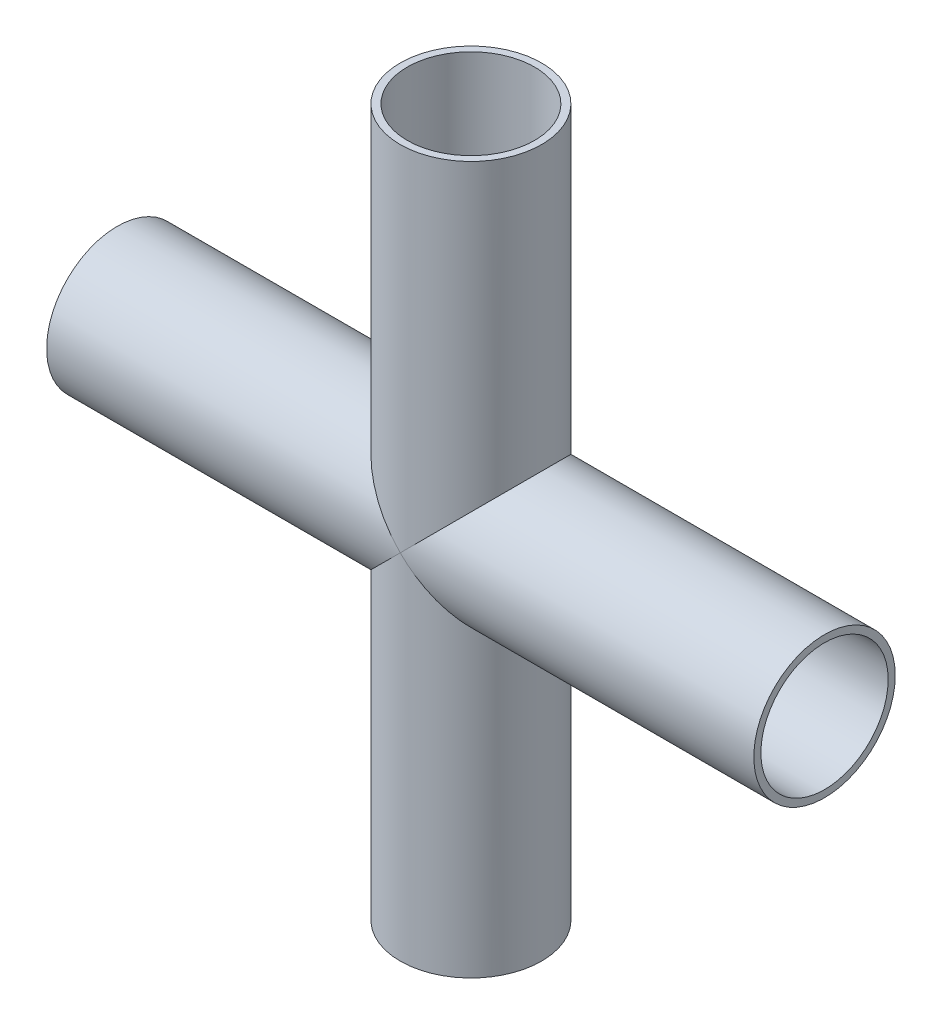
ISO-10303-21;
HEADER;
FILE_DESCRIPTION(('STEP AP214'),'2;1');
FILE_NAME('part.step','',(''),(''),'','','');
FILE_SCHEMA(('AUTOMOTIVE_DESIGN { 1 0 10303 214 1 1 1 1 }'));
ENDSEC;
DATA;
#1=APPLICATION_CONTEXT('core data for automotive mechanical design processes');
#2=APPLICATION_PROTOCOL_DEFINITION('international standard','automotive_design',2000,#1);
#3=PRODUCT_CONTEXT('',#1,'mechanical');
#4=PRODUCT('Part','Part','',(#3));
#5=PRODUCT_RELATED_PRODUCT_CATEGORY('part','',(#4));
#6=PRODUCT_DEFINITION_FORMATION('','',#4);
#7=PRODUCT_DEFINITION_CONTEXT('part definition',#1,'design');
#8=PRODUCT_DEFINITION('design','',#6,#7);
#9=PRODUCT_DEFINITION_SHAPE('','',#8);
#10=(LENGTH_UNIT() NAMED_UNIT(*) SI_UNIT(.MILLI.,.METRE.));
#11=(NAMED_UNIT(*) PLANE_ANGLE_UNIT() SI_UNIT($,.RADIAN.));
#12=(NAMED_UNIT(*) SI_UNIT($,.STERADIAN.) SOLID_ANGLE_UNIT());
#13=UNCERTAINTY_MEASURE_WITH_UNIT(LENGTH_MEASURE(1.E-05),#10,'distance_accuracy_value','');
#14=(GEOMETRIC_REPRESENTATION_CONTEXT(3) GLOBAL_UNCERTAINTY_ASSIGNED_CONTEXT((#13)) GLOBAL_UNIT_ASSIGNED_CONTEXT((#10,
#11,#12)) REPRESENTATION_CONTEXT('',''));
#15=CARTESIAN_POINT('',(0.,0.,0.));
#16=DIRECTION('',(0.,0.,1.));
#17=DIRECTION('',(1.,0.,0.));
#18=AXIS2_PLACEMENT_3D('',#15,#16,#17);
#19=CARTESIAN_POINT('',(0.,10.,0.));
#20=DIRECTION('',(0.,-1.,0.));
#21=DIRECTION('',(0.,0.,-1.));
#22=AXIS2_PLACEMENT_3D('',#19,#20,#21);
#23=CYLINDRICAL_SURFACE('',#22,0.9);
#24=CARTESIAN_POINT('',(0.,5.,0.));
#25=DIRECTION('',(0.707106781186547,-0.707106781186547,0.));
#26=DIRECTION('',(-0.707106781186547,-0.707106781186547,0.));
#27=AXIS2_PLACEMENT_3D('',#24,#25,#26);
#28=ELLIPSE('',#27,1.27279220613579,0.9);
#29=CARTESIAN_POINT('',(0.,5.,0.9));
#30=VERTEX_POINT('',#29);
#31=CARTESIAN_POINT('',(0.,5.,-0.9));
#32=VERTEX_POINT('',#31);
#33=EDGE_CURVE('E11',#30,#32,#28,.F.);
#34=ORIENTED_EDGE('',*,*,#33,.F.);
#35=CARTESIAN_POINT('',(0.,5.,0.));
#36=DIRECTION('',(-0.707106781186547,-0.707106781186547,0.));
#37=DIRECTION('',(0.707106781186547,-0.707106781186547,0.));
#38=AXIS2_PLACEMENT_3D('',#35,#36,#37);
#39=ELLIPSE('',#38,1.27279220613579,0.9);
#40=EDGE_CURVE('E50',#32,#30,#39,.F.);
#41=ORIENTED_EDGE('',*,*,#40,.F.);
#42=EDGE_LOOP('',(#34,#41));
#43=FACE_BOUND('',#42,.T.);
#44=CARTESIAN_POINT('',(0.,10.,0.));
#45=DIRECTION('',(0.,1.,0.));
#46=DIRECTION('',(0.,0.,1.));
#47=AXIS2_PLACEMENT_3D('',#44,#45,#46);
#48=CIRCLE('',#47,0.9);
#49=CARTESIAN_POINT('',(0.,10.,0.9));
#50=VERTEX_POINT('',#49);
#51=EDGE_CURVE('E82',#50,#50,#48,.T.);
#52=ORIENTED_EDGE('',*,*,#51,.T.);
#53=EDGE_LOOP('',(#52));
#54=FACE_BOUND('',#53,.T.);
#55=ADVANCED_FACE('F36',(#43,#54),#23,.F.);
#56=CARTESIAN_POINT('',(0.,10.,0.));
#57=DIRECTION('',(0.,-1.,0.));
#58=DIRECTION('',(0.,0.,-1.));
#59=AXIS2_PLACEMENT_3D('',#56,#57,#58);
#60=CYLINDRICAL_SURFACE('',#59,1.);
#61=CARTESIAN_POINT('',(0.,10.,0.));
#62=DIRECTION('',(0.,1.,0.));
#63=DIRECTION('',(0.,0.,1.));
#64=AXIS2_PLACEMENT_3D('',#61,#62,#63);
#65=CIRCLE('',#64,1.);
#66=CARTESIAN_POINT('',(0.,10.,1.));
#67=VERTEX_POINT('',#66);
#68=EDGE_CURVE('E73',#67,#67,#65,.T.);
#69=ORIENTED_EDGE('',*,*,#68,.F.);
#70=EDGE_LOOP('',(#69));
#71=FACE_BOUND('',#70,.T.);
#72=CARTESIAN_POINT('',(0.,5.,0.));
#73=DIRECTION('',(-0.707106781186547,-0.707106781186547,0.));
#74=DIRECTION('',(0.707106781186547,-0.707106781186547,0.));
#75=AXIS2_PLACEMENT_3D('',#72,#73,#74);
#76=ELLIPSE('',#75,1.41421356237309,1.);
#77=CARTESIAN_POINT('',(0.,5.,1.));
#78=VERTEX_POINT('',#77);
#79=CARTESIAN_POINT('',(0.,5.,-1.));
#80=VERTEX_POINT('',#79);
#81=EDGE_CURVE('E93',#78,#80,#76,.T.);
#82=ORIENTED_EDGE('',*,*,#81,.F.);
#83=CARTESIAN_POINT('',(0.,5.,0.));
#84=DIRECTION('',(0.707106781186547,-0.707106781186547,0.));
#85=DIRECTION('',(-0.707106781186547,-0.707106781186547,0.));
#86=AXIS2_PLACEMENT_3D('',#83,#84,#85);
#87=ELLIPSE('',#86,1.41421356237309,1.);
#88=EDGE_CURVE('E95',#80,#78,#87,.T.);
#89=ORIENTED_EDGE('',*,*,#88,.F.);
#90=EDGE_LOOP('',(#82,#89));
#91=FACE_BOUND('',#90,.T.);
#92=ADVANCED_FACE('F123',(#71,#91),#60,.T.);
#93=CARTESIAN_POINT('',(0.,10.,0.));
#94=DIRECTION('',(0.,1.,0.));
#95=DIRECTION('',(0.,0.,1.));
#96=AXIS2_PLACEMENT_3D('',#93,#94,#95);
#97=PLANE('',#96);
#98=ORIENTED_EDGE('',*,*,#68,.T.);
#99=EDGE_LOOP('',(#98));
#100=FACE_BOUND('',#99,.T.);
#101=ORIENTED_EDGE('',*,*,#51,.F.);
#102=EDGE_LOOP('',(#101));
#103=FACE_BOUND('',#102,.T.);
#104=ADVANCED_FACE('F132',(#100,#103),#97,.T.);
#105=CARTESIAN_POINT('',(5.,5.,0.));
#106=DIRECTION('',(-1.,0.,0.));
#107=DIRECTION('',(0.,0.,1.));
#108=AXIS2_PLACEMENT_3D('',#105,#106,#107);
#109=CYLINDRICAL_SURFACE('',#108,1.);
#110=CARTESIAN_POINT('',(-5.,5.,0.));
#111=DIRECTION('',(1.,0.,0.));
#112=DIRECTION('',(0.,0.,-1.));
#113=AXIS2_PLACEMENT_3D('',#110,#111,#112);
#114=CIRCLE('',#113,1.);
#115=CARTESIAN_POINT('',(-5.,5.,-1.));
#116=VERTEX_POINT('',#115);
#117=EDGE_CURVE('E100',#116,#116,#114,.T.);
#118=ORIENTED_EDGE('',*,*,#117,.T.);
#119=EDGE_LOOP('',(#118));
#120=FACE_BOUND('',#119,.T.);
#121=CARTESIAN_POINT('',(0.,5.,0.));
#122=DIRECTION('',(0.707106781186547,-0.707106781186547,0.));
#123=DIRECTION('',(-0.707106781186547,-0.707106781186547,0.));
#124=AXIS2_PLACEMENT_3D('',#121,#122,#123);
#125=ELLIPSE('',#124,1.41421356237309,1.);
#126=EDGE_CURVE('E57',#80,#78,#125,.F.);
#127=ORIENTED_EDGE('',*,*,#126,.T.);
#128=ORIENTED_EDGE('',*,*,#81,.T.);
#129=EDGE_LOOP('',(#127,#128));
#130=FACE_BOUND('',#129,.T.);
#131=ADVANCED_FACE('F146',(#120,#130),#109,.T.);
#132=CARTESIAN_POINT('',(-5.,5.,0.));
#133=DIRECTION('',(1.,0.,0.));
#134=DIRECTION('',(0.,0.,-1.));
#135=AXIS2_PLACEMENT_3D('',#132,#133,#134);
#136=PLANE('',#135);
#137=ORIENTED_EDGE('',*,*,#117,.F.);
#138=EDGE_LOOP('',(#137));
#139=FACE_BOUND('',#138,.T.);
#140=CARTESIAN_POINT('',(-5.,5.,0.));
#141=DIRECTION('',(1.,0.,0.));
#142=DIRECTION('',(0.,0.,-1.));
#143=AXIS2_PLACEMENT_3D('',#140,#141,#142);
#144=CIRCLE('',#143,0.9);
#145=CARTESIAN_POINT('',(-5.,5.,-0.9));
#146=VERTEX_POINT('',#145);
#147=EDGE_CURVE('E106',#146,#146,#144,.T.);
#148=ORIENTED_EDGE('',*,*,#147,.T.);
#149=EDGE_LOOP('',(#148));
#150=FACE_BOUND('',#149,.T.);
#151=ADVANCED_FACE('F151',(#139,#150),#136,.F.);
#152=CARTESIAN_POINT('',(5.,5.,0.));
#153=DIRECTION('',(-1.,0.,0.));
#154=DIRECTION('',(0.,0.,1.));
#155=AXIS2_PLACEMENT_3D('',#152,#153,#154);
#156=CYLINDRICAL_SURFACE('',#155,0.9);
#157=ORIENTED_EDGE('',*,*,#147,.F.);
#158=EDGE_LOOP('',(#157));
#159=FACE_BOUND('',#158,.T.);
#160=CARTESIAN_POINT('',(0.,5.,0.));
#161=DIRECTION('',(0.707106781186547,-0.707106781186547,0.));
#162=DIRECTION('',(-0.707106781186547,-0.707106781186547,0.));
#163=AXIS2_PLACEMENT_3D('',#160,#161,#162);
#164=ELLIPSE('',#163,1.27279220613579,0.9);
#165=EDGE_CURVE('E44',#30,#32,#164,.T.);
#166=ORIENTED_EDGE('',*,*,#165,.T.);
#167=ORIENTED_EDGE('',*,*,#40,.T.);
#168=EDGE_LOOP('',(#166,#167));
#169=FACE_BOUND('',#168,.T.);
#170=ADVANCED_FACE('F72',(#159,#169),#156,.F.);
#171=CARTESIAN_POINT('',(5.,5.,0.));
#172=DIRECTION('',(1.,0.,0.));
#173=DIRECTION('',(0.,0.,-1.));
#174=AXIS2_PLACEMENT_3D('',#171,#172,#173);
#175=CIRCLE('',#174,1.);
#176=CARTESIAN_POINT('',(5.,5.,-1.));
#177=VERTEX_POINT('',#176);
#178=EDGE_CURVE('E99',#177,#177,#175,.T.);
#179=ORIENTED_EDGE('',*,*,#178,.F.);
#180=EDGE_LOOP('',(#179));
#181=FACE_BOUND('',#180,.T.);
#182=ORIENTED_EDGE('',*,*,#88,.T.);
#183=CARTESIAN_POINT('',(0.,5.,0.));
#184=DIRECTION('',(-0.707106781186547,-0.707106781186547,0.));
#185=DIRECTION('',(0.707106781186547,-0.707106781186547,0.));
#186=AXIS2_PLACEMENT_3D('',#183,#184,#185);
#187=ELLIPSE('',#186,1.41421356237309,1.);
#188=EDGE_CURVE('E88',#78,#80,#187,.F.);
#189=ORIENTED_EDGE('',*,*,#188,.T.);
#190=EDGE_LOOP('',(#182,#189));
#191=FACE_BOUND('',#190,.T.);
#192=ADVANCED_FACE('F124',(#181,#191),#109,.T.);
#193=CARTESIAN_POINT('',(5.,5.,0.));
#194=DIRECTION('',(1.,0.,0.));
#195=DIRECTION('',(0.,0.,-1.));
#196=AXIS2_PLACEMENT_3D('',#193,#194,#195);
#197=CIRCLE('',#196,0.9);
#198=CARTESIAN_POINT('',(5.,5.,-0.9));
#199=VERTEX_POINT('',#198);
#200=EDGE_CURVE('E103',#199,#199,#197,.T.);
#201=ORIENTED_EDGE('',*,*,#200,.T.);
#202=EDGE_LOOP('',(#201));
#203=FACE_BOUND('',#202,.T.);
#204=ORIENTED_EDGE('',*,*,#33,.T.);
#205=CARTESIAN_POINT('',(0.,5.,0.));
#206=DIRECTION('',(-0.707106781186547,-0.707106781186547,0.));
#207=DIRECTION('',(0.707106781186547,-0.707106781186547,0.));
#208=AXIS2_PLACEMENT_3D('',#205,#206,#207);
#209=ELLIPSE('',#208,1.27279220613579,0.9);
#210=EDGE_CURVE('E66',#32,#30,#209,.T.);
#211=ORIENTED_EDGE('',*,*,#210,.T.);
#212=EDGE_LOOP('',(#204,#211));
#213=FACE_BOUND('',#212,.T.);
#214=ADVANCED_FACE('F67',(#203,#213),#156,.F.);
#215=CARTESIAN_POINT('',(5.,5.,0.));
#216=DIRECTION('',(1.,0.,0.));
#217=DIRECTION('',(0.,0.,-1.));
#218=AXIS2_PLACEMENT_3D('',#215,#216,#217);
#219=PLANE('',#218);
#220=ORIENTED_EDGE('',*,*,#178,.T.);
#221=EDGE_LOOP('',(#220));
#222=FACE_BOUND('',#221,.T.);
#223=ORIENTED_EDGE('',*,*,#200,.F.);
#224=EDGE_LOOP('',(#223));
#225=FACE_BOUND('',#224,.T.);
#226=ADVANCED_FACE('F113',(#222,#225),#219,.T.);
#227=CARTESIAN_POINT('',(0.,0.,0.));
#228=DIRECTION('',(0.,1.,0.));
#229=DIRECTION('',(0.,0.,1.));
#230=AXIS2_PLACEMENT_3D('',#227,#228,#229);
#231=CIRCLE('',#230,1.);
#232=CARTESIAN_POINT('',(0.,0.,1.));
#233=VERTEX_POINT('',#232);
#234=EDGE_CURVE('E79',#233,#233,#231,.T.);
#235=ORIENTED_EDGE('',*,*,#234,.T.);
#236=EDGE_LOOP('',(#235));
#237=FACE_BOUND('',#236,.T.);
#238=ORIENTED_EDGE('',*,*,#188,.F.);
#239=ORIENTED_EDGE('',*,*,#126,.F.);
#240=EDGE_LOOP('',(#238,#239));
#241=FACE_BOUND('',#240,.T.);
#242=ADVANCED_FACE('F38',(#237,#241),#60,.T.);
#243=CARTESIAN_POINT('',(0.,0.,0.));
#244=DIRECTION('',(0.,1.,0.));
#245=DIRECTION('',(0.,0.,1.));
#246=AXIS2_PLACEMENT_3D('',#243,#244,#245);
#247=PLANE('',#246);
#248=ORIENTED_EDGE('',*,*,#234,.F.);
#249=EDGE_LOOP('',(#248));
#250=FACE_BOUND('',#249,.T.);
#251=CARTESIAN_POINT('',(0.,0.,0.));
#252=DIRECTION('',(0.,1.,0.));
#253=DIRECTION('',(0.,0.,1.));
#254=AXIS2_PLACEMENT_3D('',#251,#252,#253);
#255=CIRCLE('',#254,0.9);
#256=CARTESIAN_POINT('',(0.,0.,0.9));
#257=VERTEX_POINT('',#256);
#258=EDGE_CURVE('E85',#257,#257,#255,.T.);
#259=ORIENTED_EDGE('',*,*,#258,.T.);
#260=EDGE_LOOP('',(#259));
#261=FACE_BOUND('',#260,.T.);
#262=ADVANCED_FACE('F121',(#250,#261),#247,.F.);
#263=ORIENTED_EDGE('',*,*,#165,.F.);
#264=ORIENTED_EDGE('',*,*,#210,.F.);
#265=EDGE_LOOP('',(#263,#264));
#266=FACE_BOUND('',#265,.T.);
#267=ORIENTED_EDGE('',*,*,#258,.F.);
#268=EDGE_LOOP('',(#267));
#269=FACE_BOUND('',#268,.T.);
#270=ADVANCED_FACE('F76',(#266,#269),#23,.F.);
#271=CLOSED_SHELL('',(#55,#92,#104,#131,#151,#170,#192,#214,#226,#242,#262,#270));
#272=MANIFOLD_SOLID_BREP('B2',#271);
#273=ADVANCED_BREP_SHAPE_REPRESENTATION('',(#18,#272),#14);
#274=SHAPE_DEFINITION_REPRESENTATION(#9,#273);
ENDSEC;
END-ISO-10303-21;
